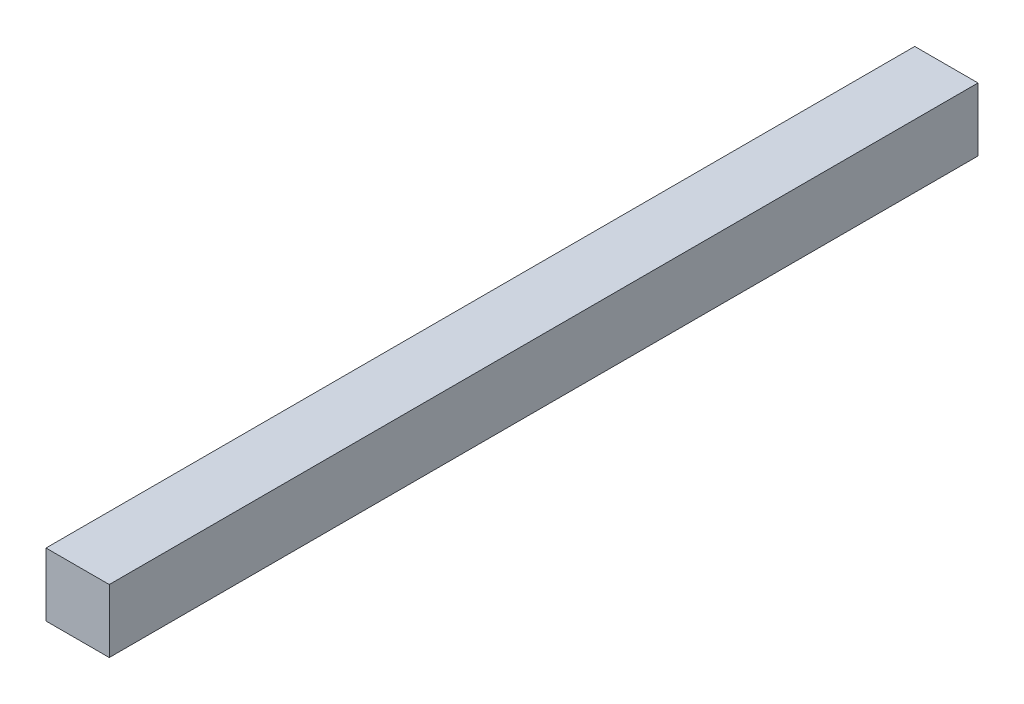
ISO-10303-21;
HEADER;
FILE_DESCRIPTION(('STEP AP214'),'2;1');
FILE_NAME('part.step','',(''),(''),'','','');
FILE_SCHEMA(('AUTOMOTIVE_DESIGN { 1 0 10303 214 1 1 1 1 }'));
ENDSEC;
DATA;
#1=APPLICATION_CONTEXT('core data for automotive mechanical design processes');
#2=APPLICATION_PROTOCOL_DEFINITION('international standard','automotive_design',2000,#1);
#3=PRODUCT_CONTEXT('',#1,'mechanical');
#4=PRODUCT('Part','Part','',(#3));
#5=PRODUCT_RELATED_PRODUCT_CATEGORY('part','',(#4));
#6=PRODUCT_DEFINITION_FORMATION('','',#4);
#7=PRODUCT_DEFINITION_CONTEXT('part definition',#1,'design');
#8=PRODUCT_DEFINITION('design','',#6,#7);
#9=PRODUCT_DEFINITION_SHAPE('','',#8);
#10=(LENGTH_UNIT() NAMED_UNIT(*) SI_UNIT(.MILLI.,.METRE.));
#11=(NAMED_UNIT(*) PLANE_ANGLE_UNIT() SI_UNIT($,.RADIAN.));
#12=(NAMED_UNIT(*) SI_UNIT($,.STERADIAN.) SOLID_ANGLE_UNIT());
#13=UNCERTAINTY_MEASURE_WITH_UNIT(LENGTH_MEASURE(1.E-05),#10,'distance_accuracy_value','');
#14=(GEOMETRIC_REPRESENTATION_CONTEXT(3) GLOBAL_UNCERTAINTY_ASSIGNED_CONTEXT((#13)) GLOBAL_UNIT_ASSIGNED_CONTEXT((#10,
#11,#12)) REPRESENTATION_CONTEXT('',''));
#15=CARTESIAN_POINT('',(0.,0.,0.));
#16=DIRECTION('',(0.,0.,1.));
#17=DIRECTION('',(1.,0.,0.));
#18=AXIS2_PLACEMENT_3D('',#15,#16,#17);
#19=CARTESIAN_POINT('',(-15.,-15.,206.));
#20=DIRECTION('',(1.,0.,0.));
#21=DIRECTION('',(0.,0.,-1.));
#22=AXIS2_PLACEMENT_3D('',#19,#20,#21);
#23=PLANE('',#22);
#24=DIRECTION('',(0.,-1.,0.));
#25=VECTOR('',#24,1.);
#26=CARTESIAN_POINT('',(-15.,-15.,-206.));
#27=LINE('',#26,#25);
#28=CARTESIAN_POINT('',(-15.,15.,-206.));
#29=VERTEX_POINT('',#28);
#30=CARTESIAN_POINT('',(-15.,-15.,-206.));
#31=VERTEX_POINT('',#30);
#32=EDGE_CURVE('E107',#29,#31,#27,.T.);
#33=ORIENTED_EDGE('',*,*,#32,.T.);
#34=DIRECTION('',(0.,0.,-1.));
#35=VECTOR('',#34,1.);
#36=CARTESIAN_POINT('',(-15.,-15.,206.));
#37=LINE('',#36,#35);
#38=CARTESIAN_POINT('',(-15.,-15.,206.));
#39=VERTEX_POINT('',#38);
#40=EDGE_CURVE('E11',#39,#31,#37,.T.);
#41=ORIENTED_EDGE('',*,*,#40,.F.);
#42=DIRECTION('',(0.,-1.,0.));
#43=VECTOR('',#42,1.);
#44=CARTESIAN_POINT('',(-15.,-15.,206.));
#45=LINE('',#44,#43);
#46=CARTESIAN_POINT('',(-15.,15.,206.));
#47=VERTEX_POINT('',#46);
#48=EDGE_CURVE('E91',#47,#39,#45,.T.);
#49=ORIENTED_EDGE('',*,*,#48,.F.);
#50=DIRECTION('',(0.,0.,-1.));
#51=VECTOR('',#50,1.);
#52=CARTESIAN_POINT('',(-15.,15.,206.));
#53=LINE('',#52,#51);
#54=EDGE_CURVE('E103',#47,#29,#53,.T.);
#55=ORIENTED_EDGE('',*,*,#54,.T.);
#56=EDGE_LOOP('',(#33,#41,#49,#55));
#57=FACE_BOUND('',#56,.T.);
#58=ADVANCED_FACE('F39',(#57),#23,.F.);
#59=CARTESIAN_POINT('',(15.,-15.,206.));
#60=DIRECTION('',(0.,1.,0.));
#61=DIRECTION('',(0.,0.,1.));
#62=AXIS2_PLACEMENT_3D('',#59,#60,#61);
#63=PLANE('',#62);
#64=DIRECTION('',(1.,0.,0.));
#65=VECTOR('',#64,1.);
#66=CARTESIAN_POINT('',(15.,-15.,-206.));
#67=LINE('',#66,#65);
#68=CARTESIAN_POINT('',(15.,-15.,-206.));
#69=VERTEX_POINT('',#68);
#70=EDGE_CURVE('E96',#31,#69,#67,.T.);
#71=ORIENTED_EDGE('',*,*,#70,.T.);
#72=DIRECTION('',(0.,0.,-1.));
#73=VECTOR('',#72,1.);
#74=CARTESIAN_POINT('',(15.,-15.,206.));
#75=LINE('',#74,#73);
#76=CARTESIAN_POINT('',(15.,-15.,206.));
#77=VERTEX_POINT('',#76);
#78=EDGE_CURVE('E48',#77,#69,#75,.T.);
#79=ORIENTED_EDGE('',*,*,#78,.F.);
#80=DIRECTION('',(1.,0.,0.));
#81=VECTOR('',#80,1.);
#82=CARTESIAN_POINT('',(15.,-15.,206.));
#83=LINE('',#82,#81);
#84=EDGE_CURVE('E86',#39,#77,#83,.T.);
#85=ORIENTED_EDGE('',*,*,#84,.F.);
#86=ORIENTED_EDGE('',*,*,#40,.T.);
#87=EDGE_LOOP('',(#71,#79,#85,#86));
#88=FACE_BOUND('',#87,.T.);
#89=ADVANCED_FACE('F95',(#88),#63,.F.);
#90=CARTESIAN_POINT('',(15.,-15.,206.));
#91=DIRECTION('',(-1.,0.,0.));
#92=DIRECTION('',(0.,0.,1.));
#93=AXIS2_PLACEMENT_3D('',#90,#91,#92);
#94=PLANE('',#93);
#95=DIRECTION('',(0.,1.,0.));
#96=VECTOR('',#95,1.);
#97=CARTESIAN_POINT('',(15.,-15.,-206.));
#98=LINE('',#97,#96);
#99=CARTESIAN_POINT('',(15.,15.,-206.));
#100=VERTEX_POINT('',#99);
#101=EDGE_CURVE('E73',#69,#100,#98,.T.);
#102=ORIENTED_EDGE('',*,*,#101,.T.);
#103=DIRECTION('',(0.,0.,-1.));
#104=VECTOR('',#103,1.);
#105=CARTESIAN_POINT('',(15.,15.,206.));
#106=LINE('',#105,#104);
#107=CARTESIAN_POINT('',(15.,15.,206.));
#108=VERTEX_POINT('',#107);
#109=EDGE_CURVE('E98',#108,#100,#106,.T.);
#110=ORIENTED_EDGE('',*,*,#109,.F.);
#111=DIRECTION('',(0.,1.,0.));
#112=VECTOR('',#111,1.);
#113=CARTESIAN_POINT('',(15.,-15.,206.));
#114=LINE('',#113,#112);
#115=EDGE_CURVE('E89',#77,#108,#114,.T.);
#116=ORIENTED_EDGE('',*,*,#115,.F.);
#117=ORIENTED_EDGE('',*,*,#78,.T.);
#118=EDGE_LOOP('',(#102,#110,#116,#117));
#119=FACE_BOUND('',#118,.T.);
#120=ADVANCED_FACE('F99',(#119),#94,.F.);
#121=CARTESIAN_POINT('',(15.,15.,206.));
#122=DIRECTION('',(0.,-1.,0.));
#123=DIRECTION('',(0.,0.,-1.));
#124=AXIS2_PLACEMENT_3D('',#121,#122,#123);
#125=PLANE('',#124);
#126=DIRECTION('',(-1.,0.,0.));
#127=VECTOR('',#126,1.);
#128=CARTESIAN_POINT('',(15.,15.,-206.));
#129=LINE('',#128,#127);
#130=EDGE_CURVE('E79',#100,#29,#129,.T.);
#131=ORIENTED_EDGE('',*,*,#130,.T.);
#132=ORIENTED_EDGE('',*,*,#54,.F.);
#133=DIRECTION('',(-1.,0.,0.));
#134=VECTOR('',#133,1.);
#135=CARTESIAN_POINT('',(15.,15.,206.));
#136=LINE('',#135,#134);
#137=EDGE_CURVE('E56',#108,#47,#136,.T.);
#138=ORIENTED_EDGE('',*,*,#137,.F.);
#139=ORIENTED_EDGE('',*,*,#109,.T.);
#140=EDGE_LOOP('',(#131,#132,#138,#139));
#141=FACE_BOUND('',#140,.T.);
#142=ADVANCED_FACE('F120',(#141),#125,.F.);
#143=CARTESIAN_POINT('',(0.,0.,206.));
#144=DIRECTION('',(0.,0.,1.));
#145=DIRECTION('',(1.,0.,0.));
#146=AXIS2_PLACEMENT_3D('',#143,#144,#145);
#147=PLANE('',#146);
#148=ORIENTED_EDGE('',*,*,#48,.T.);
#149=ORIENTED_EDGE('',*,*,#84,.T.);
#150=ORIENTED_EDGE('',*,*,#115,.T.);
#151=ORIENTED_EDGE('',*,*,#137,.T.);
#152=EDGE_LOOP('',(#148,#149,#150,#151));
#153=FACE_BOUND('',#152,.T.);
#154=ADVANCED_FACE('F87',(#153),#147,.T.);
#155=CARTESIAN_POINT('',(0.,0.,-206.));
#156=DIRECTION('',(0.,0.,1.));
#157=DIRECTION('',(1.,0.,0.));
#158=AXIS2_PLACEMENT_3D('',#155,#156,#157);
#159=PLANE('',#158);
#160=ORIENTED_EDGE('',*,*,#32,.F.);
#161=ORIENTED_EDGE('',*,*,#130,.F.);
#162=ORIENTED_EDGE('',*,*,#101,.F.);
#163=ORIENTED_EDGE('',*,*,#70,.F.);
#164=EDGE_LOOP('',(#160,#161,#162,#163));
#165=FACE_BOUND('',#164,.T.);
#166=ADVANCED_FACE('F123',(#165),#159,.F.);
#167=CLOSED_SHELL('',(#58,#89,#120,#142,#154,#166));
#168=MANIFOLD_SOLID_BREP('B2',#167);
#169=ADVANCED_BREP_SHAPE_REPRESENTATION('',(#18,#168),#14);
#170=SHAPE_DEFINITION_REPRESENTATION(#9,#169);
ENDSEC;
END-ISO-10303-21;
